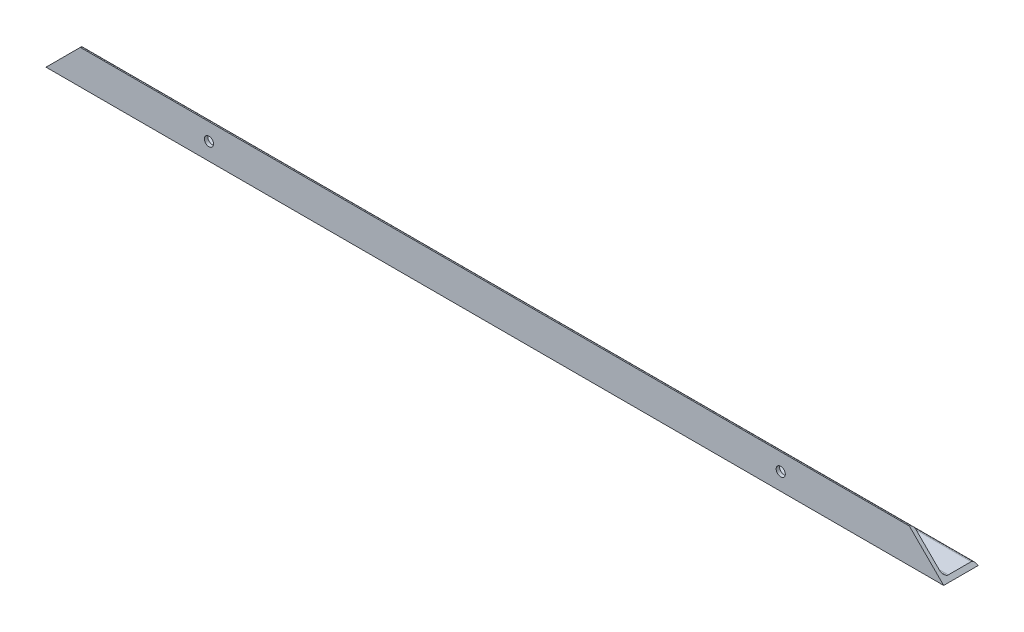
ISO-10303-21;
HEADER;
FILE_DESCRIPTION(('STEP AP214'),'2;1');
FILE_NAME('part.step','',(''),(''),'','','');
FILE_SCHEMA(('AUTOMOTIVE_DESIGN { 1 0 10303 214 1 1 1 1 }'));
ENDSEC;
DATA;
#1=APPLICATION_CONTEXT('core data for automotive mechanical design processes');
#2=APPLICATION_PROTOCOL_DEFINITION('international standard','automotive_design',2000,#1);
#3=PRODUCT_CONTEXT('',#1,'mechanical');
#4=PRODUCT('Part','Part','',(#3));
#5=PRODUCT_RELATED_PRODUCT_CATEGORY('part','',(#4));
#6=PRODUCT_DEFINITION_FORMATION('','',#4);
#7=PRODUCT_DEFINITION_CONTEXT('part definition',#1,'design');
#8=PRODUCT_DEFINITION('design','',#6,#7);
#9=PRODUCT_DEFINITION_SHAPE('','',#8);
#10=(LENGTH_UNIT() NAMED_UNIT(*) SI_UNIT(.MILLI.,.METRE.));
#11=(NAMED_UNIT(*) PLANE_ANGLE_UNIT() SI_UNIT($,.RADIAN.));
#12=(NAMED_UNIT(*) SI_UNIT($,.STERADIAN.) SOLID_ANGLE_UNIT());
#13=UNCERTAINTY_MEASURE_WITH_UNIT(LENGTH_MEASURE(1.E-05),#10,'distance_accuracy_value','');
#14=(GEOMETRIC_REPRESENTATION_CONTEXT(3) GLOBAL_UNCERTAINTY_ASSIGNED_CONTEXT((#13)) GLOBAL_UNIT_ASSIGNED_CONTEXT((#10,
#11,#12)) REPRESENTATION_CONTEXT('',''));
#15=CARTESIAN_POINT('',(0.,0.,0.));
#16=DIRECTION('',(0.,0.,1.));
#17=DIRECTION('',(1.,0.,0.));
#18=AXIS2_PLACEMENT_3D('',#15,#16,#17);
#19=CARTESIAN_POINT('',(1570.,0.,-60.));
#20=DIRECTION('',(0.,1.,0.));
#21=DIRECTION('',(0.,0.,1.));
#22=AXIS2_PLACEMENT_3D('',#19,#20,#21);
#23=PLANE('',#22);
#24=DIRECTION('',(0.,0.,-1.));
#25=VECTOR('',#24,1.);
#26=CARTESIAN_POINT('',(0.,0.,-60.));
#27=LINE('',#26,#25);
#28=CARTESIAN_POINT('',(0.,0.,0.));
#29=VERTEX_POINT('',#28);
#30=CARTESIAN_POINT('',(0.,0.,-60.));
#31=VERTEX_POINT('',#30);
#32=EDGE_CURVE('E113',#29,#31,#27,.T.);
#33=ORIENTED_EDGE('',*,*,#32,.T.);
#34=DIRECTION('',(-1.,0.,0.));
#35=VECTOR('',#34,1.);
#36=CARTESIAN_POINT('',(1570.,0.,-60.));
#37=LINE('',#36,#35);
#38=CARTESIAN_POINT('',(1570.,0.,-60.));
#39=VERTEX_POINT('',#38);
#40=EDGE_CURVE('E13',#39,#31,#37,.T.);
#41=ORIENTED_EDGE('',*,*,#40,.F.);
#42=DIRECTION('',(0.,0.,-1.));
#43=VECTOR('',#42,1.);
#44=CARTESIAN_POINT('',(1570.,0.,-60.));
#45=LINE('',#44,#43);
#46=CARTESIAN_POINT('',(1570.,0.,0.));
#47=VERTEX_POINT('',#46);
#48=EDGE_CURVE('E123',#47,#39,#45,.T.);
#49=ORIENTED_EDGE('',*,*,#48,.F.);
#50=DIRECTION('',(-1.,0.,0.));
#51=VECTOR('',#50,1.);
#52=CARTESIAN_POINT('',(1570.,0.,0.));
#53=LINE('',#52,#51);
#54=EDGE_CURVE('E129',#47,#29,#53,.T.);
#55=ORIENTED_EDGE('',*,*,#54,.T.);
#56=EDGE_LOOP('',(#33,#41,#49,#55));
#57=FACE_BOUND('',#56,.T.);
#58=ADVANCED_FACE('F60',(#57),#23,.F.);
#59=CARTESIAN_POINT('',(1570.,0.,-54.));
#60=DIRECTION('',(-1.,0.,0.));
#61=DIRECTION('',(0.,0.,1.));
#62=AXIS2_PLACEMENT_3D('',#59,#60,#61);
#63=CYLINDRICAL_SURFACE('',#62,6.);
#64=ORIENTED_EDGE('',*,*,#40,.T.);
#65=CARTESIAN_POINT('',(0.,0.,-54.));
#66=DIRECTION('',(0.707106781186547,-0.707106781186547,0.));
#67=DIRECTION('',(-0.707106781186548,-0.707106781186548,0.));
#68=AXIS2_PLACEMENT_3D('',#65,#66,#67);
#69=ELLIPSE('',#68,8.48528137423857,6.);
#70=CARTESIAN_POINT('',(6.00000000000001,6.,-54.));
#71=VERTEX_POINT('',#70);
#72=EDGE_CURVE('E119',#31,#71,#69,.T.);
#73=ORIENTED_EDGE('',*,*,#72,.T.);
#74=DIRECTION('',(-1.,0.,0.));
#75=VECTOR('',#74,1.);
#76=CARTESIAN_POINT('',(1570.,6.,-54.));
#77=LINE('',#76,#75);
#78=CARTESIAN_POINT('',(1564.,6.,-54.));
#79=VERTEX_POINT('',#78);
#80=EDGE_CURVE('E68',#79,#71,#77,.T.);
#81=ORIENTED_EDGE('',*,*,#80,.F.);
#82=CARTESIAN_POINT('',(1570.,0.,-54.));
#83=DIRECTION('',(-0.707106781186547,-0.707106781186548,0.));
#84=DIRECTION('',(-0.707106781186548,0.707106781186547,0.));
#85=AXIS2_PLACEMENT_3D('',#82,#83,#84);
#86=ELLIPSE('',#85,8.48528137423857,6.);
#87=EDGE_CURVE('E159',#79,#39,#86,.T.);
#88=ORIENTED_EDGE('',*,*,#87,.T.);
#89=EDGE_LOOP('',(#64,#73,#81,#88));
#90=FACE_BOUND('',#89,.T.);
#91=ADVANCED_FACE('F158',(#90),#63,.T.);
#92=CARTESIAN_POINT('',(1570.,6.,-14.));
#93=DIRECTION('',(0.,-1.,0.));
#94=DIRECTION('',(0.,0.,-1.));
#95=AXIS2_PLACEMENT_3D('',#92,#93,#94);
#96=PLANE('',#95);
#97=ORIENTED_EDGE('',*,*,#80,.T.);
#98=DIRECTION('',(0.,0.,1.));
#99=VECTOR('',#98,1.);
#100=CARTESIAN_POINT('',(6.00000000000001,6.,-14.));
#101=LINE('',#100,#99);
#102=CARTESIAN_POINT('',(6.00000000000001,6.,-14.));
#103=VERTEX_POINT('',#102);
#104=EDGE_CURVE('E154',#71,#103,#101,.T.);
#105=ORIENTED_EDGE('',*,*,#104,.T.);
#106=DIRECTION('',(-1.,0.,0.));
#107=VECTOR('',#106,1.);
#108=CARTESIAN_POINT('',(1570.,6.,-14.));
#109=LINE('',#108,#107);
#110=CARTESIAN_POINT('',(1564.,6.,-14.));
#111=VERTEX_POINT('',#110);
#112=EDGE_CURVE('E145',#111,#103,#109,.T.);
#113=ORIENTED_EDGE('',*,*,#112,.F.);
#114=DIRECTION('',(0.,0.,-1.));
#115=VECTOR('',#114,1.);
#116=CARTESIAN_POINT('',(1564.,6.,-14.));
#117=LINE('',#116,#115);
#118=EDGE_CURVE('E155',#111,#79,#117,.T.);
#119=ORIENTED_EDGE('',*,*,#118,.T.);
#120=EDGE_LOOP('',(#97,#105,#113,#119));
#121=FACE_BOUND('',#120,.T.);
#122=ADVANCED_FACE('F152',(#121),#96,.F.);
#123=CARTESIAN_POINT('',(1570.,14.,-14.));
#124=DIRECTION('',(-1.,0.,0.));
#125=DIRECTION('',(0.,0.,1.));
#126=AXIS2_PLACEMENT_3D('',#123,#124,#125);
#127=CYLINDRICAL_SURFACE('',#126,8.);
#128=ORIENTED_EDGE('',*,*,#112,.T.);
#129=CARTESIAN_POINT('',(14.,14.,-14.));
#130=DIRECTION('',(0.707106781186547,-0.707106781186547,0.));
#131=DIRECTION('',(-0.707106781186548,-0.707106781186548,0.));
#132=AXIS2_PLACEMENT_3D('',#129,#130,#131);
#133=ELLIPSE('',#132,11.3137084989848,8.);
#134=CARTESIAN_POINT('',(14.0000000000001,14.0000000000001,-6.));
#135=VERTEX_POINT('',#134);
#136=EDGE_CURVE('E165',#103,#135,#133,.F.);
#137=ORIENTED_EDGE('',*,*,#136,.T.);
#138=DIRECTION('',(-1.,0.,0.));
#139=VECTOR('',#138,1.);
#140=CARTESIAN_POINT('',(1570.,14.,-6.));
#141=LINE('',#140,#139);
#142=CARTESIAN_POINT('',(1556.,14.,-6.));
#143=VERTEX_POINT('',#142);
#144=EDGE_CURVE('E142',#143,#135,#141,.T.);
#145=ORIENTED_EDGE('',*,*,#144,.F.);
#146=CARTESIAN_POINT('',(1556.,14.,-14.));
#147=DIRECTION('',(-0.707106781186547,-0.707106781186548,0.));
#148=DIRECTION('',(-0.707106781186548,0.707106781186547,0.));
#149=AXIS2_PLACEMENT_3D('',#146,#147,#148);
#150=ELLIPSE('',#149,11.3137084989848,8.);
#151=EDGE_CURVE('E171',#143,#111,#150,.F.);
#152=ORIENTED_EDGE('',*,*,#151,.T.);
#153=EDGE_LOOP('',(#128,#137,#145,#152));
#154=FACE_BOUND('',#153,.T.);
#155=ADVANCED_FACE('F206',(#154),#127,.F.);
#156=CARTESIAN_POINT('',(1570.,54.,-6.));
#157=DIRECTION('',(0.,0.,1.));
#158=DIRECTION('',(1.,0.,0.));
#159=AXIS2_PLACEMENT_3D('',#156,#157,#158);
#160=PLANE('',#159);
#161=CARTESIAN_POINT('',(1285.,29.9999999999999,-6.));
#162=DIRECTION('',(0.,0.,1.));
#163=DIRECTION('',(1.,0.,0.));
#164=AXIS2_PLACEMENT_3D('',#161,#162,#163);
#165=CIRCLE('',#164,7.99999999999998);
#166=CARTESIAN_POINT('',(1293.,29.9999999999999,-6.));
#167=VERTEX_POINT('',#166);
#168=EDGE_CURVE('E124',#167,#167,#165,.T.);
#169=ORIENTED_EDGE('',*,*,#168,.T.);
#170=EDGE_LOOP('',(#169));
#171=FACE_BOUND('',#170,.T.);
#172=CARTESIAN_POINT('',(285.,29.9999999999999,-6.));
#173=DIRECTION('',(0.,0.,1.));
#174=DIRECTION('',(1.,0.,0.));
#175=AXIS2_PLACEMENT_3D('',#172,#173,#174);
#176=CIRCLE('',#175,7.99999999999998);
#177=CARTESIAN_POINT('',(293.,29.9999999999999,-6.));
#178=VERTEX_POINT('',#177);
#179=EDGE_CURVE('E176',#178,#178,#176,.T.);
#180=ORIENTED_EDGE('',*,*,#179,.T.);
#181=EDGE_LOOP('',(#180));
#182=FACE_BOUND('',#181,.T.);
#183=ORIENTED_EDGE('',*,*,#144,.T.);
#184=DIRECTION('',(0.707106781186548,0.707106781186548,0.));
#185=VECTOR('',#184,1.);
#186=CARTESIAN_POINT('',(812.,812.,-6.));
#187=LINE('',#186,#185);
#188=CARTESIAN_POINT('',(54.,54.,-6.));
#189=VERTEX_POINT('',#188);
#190=EDGE_CURVE('E229',#135,#189,#187,.T.);
#191=ORIENTED_EDGE('',*,*,#190,.T.);
#192=DIRECTION('',(-1.,0.,0.));
#193=VECTOR('',#192,1.);
#194=CARTESIAN_POINT('',(1570.,54.,-6.));
#195=LINE('',#194,#193);
#196=CARTESIAN_POINT('',(1516.,54.,-6.));
#197=VERTEX_POINT('',#196);
#198=EDGE_CURVE('E136',#197,#189,#195,.T.);
#199=ORIENTED_EDGE('',*,*,#198,.F.);
#200=DIRECTION('',(0.707106781186548,-0.707106781186547,0.));
#201=VECTOR('',#200,1.);
#202=CARTESIAN_POINT('',(1543.,27.,-6.));
#203=LINE('',#202,#201);
#204=EDGE_CURVE('E163',#197,#143,#203,.T.);
#205=ORIENTED_EDGE('',*,*,#204,.T.);
#206=EDGE_LOOP('',(#183,#191,#199,#205));
#207=FACE_BOUND('',#206,.T.);
#208=ADVANCED_FACE('F182',(#171,#182,#207),#160,.F.);
#209=CARTESIAN_POINT('',(1570.,54.,0.));
#210=DIRECTION('',(-1.,0.,0.));
#211=DIRECTION('',(0.,0.,1.));
#212=AXIS2_PLACEMENT_3D('',#209,#210,#211);
#213=CYLINDRICAL_SURFACE('',#212,6.);
#214=ORIENTED_EDGE('',*,*,#198,.T.);
#215=CARTESIAN_POINT('',(54.,54.,0.));
#216=DIRECTION('',(0.707106781186547,-0.707106781186547,0.));
#217=DIRECTION('',(-0.707106781186548,-0.707106781186548,0.));
#218=AXIS2_PLACEMENT_3D('',#215,#216,#217);
#219=ELLIPSE('',#218,8.48528137423857,6.);
#220=CARTESIAN_POINT('',(60.,60.,0.));
#221=VERTEX_POINT('',#220);
#222=EDGE_CURVE('E133',#189,#221,#219,.T.);
#223=ORIENTED_EDGE('',*,*,#222,.T.);
#224=DIRECTION('',(-1.,0.,0.));
#225=VECTOR('',#224,1.);
#226=CARTESIAN_POINT('',(1570.,60.,0.));
#227=LINE('',#226,#225);
#228=CARTESIAN_POINT('',(1510.,60.,0.));
#229=VERTEX_POINT('',#228);
#230=EDGE_CURVE('E132',#229,#221,#227,.T.);
#231=ORIENTED_EDGE('',*,*,#230,.F.);
#232=CARTESIAN_POINT('',(1516.,54.,0.));
#233=DIRECTION('',(-0.707106781186547,-0.707106781186548,0.));
#234=DIRECTION('',(-0.707106781186548,0.707106781186547,0.));
#235=AXIS2_PLACEMENT_3D('',#232,#233,#234);
#236=ELLIPSE('',#235,8.48528137423858,6.);
#237=EDGE_CURVE('E160',#229,#197,#236,.T.);
#238=ORIENTED_EDGE('',*,*,#237,.T.);
#239=EDGE_LOOP('',(#214,#223,#231,#238));
#240=FACE_BOUND('',#239,.T.);
#241=ADVANCED_FACE('F214',(#240),#213,.T.);
#242=CARTESIAN_POINT('',(1570.,60.,0.));
#243=DIRECTION('',(0.,0.,-1.));
#244=DIRECTION('',(-1.,0.,0.));
#245=AXIS2_PLACEMENT_3D('',#242,#243,#244);
#246=PLANE('',#245);
#247=CARTESIAN_POINT('',(1285.,29.9999999999999,0.));
#248=DIRECTION('',(0.,0.,1.));
#249=DIRECTION('',(1.,0.,0.));
#250=AXIS2_PLACEMENT_3D('',#247,#248,#249);
#251=CIRCLE('',#250,7.99999999999998);
#252=CARTESIAN_POINT('',(1293.,29.9999999999999,0.));
#253=VERTEX_POINT('',#252);
#254=EDGE_CURVE('E236',#253,#253,#251,.T.);
#255=ORIENTED_EDGE('',*,*,#254,.F.);
#256=EDGE_LOOP('',(#255));
#257=FACE_BOUND('',#256,.T.);
#258=CARTESIAN_POINT('',(285.,29.9999999999999,0.));
#259=DIRECTION('',(0.,0.,1.));
#260=DIRECTION('',(1.,0.,0.));
#261=AXIS2_PLACEMENT_3D('',#258,#259,#260);
#262=CIRCLE('',#261,7.99999999999998);
#263=CARTESIAN_POINT('',(293.,29.9999999999999,0.));
#264=VERTEX_POINT('',#263);
#265=EDGE_CURVE('E233',#264,#264,#262,.T.);
#266=ORIENTED_EDGE('',*,*,#265,.F.);
#267=EDGE_LOOP('',(#266));
#268=FACE_BOUND('',#267,.T.);
#269=ORIENTED_EDGE('',*,*,#230,.T.);
#270=DIRECTION('',(0.707106781186547,0.707106781186547,0.));
#271=VECTOR('',#270,1.);
#272=CARTESIAN_POINT('',(60.,60.,0.));
#273=LINE('',#272,#271);
#274=EDGE_CURVE('E116',#29,#221,#273,.T.);
#275=ORIENTED_EDGE('',*,*,#274,.F.);
#276=ORIENTED_EDGE('',*,*,#54,.F.);
#277=DIRECTION('',(0.707106781186548,-0.707106781186547,0.));
#278=VECTOR('',#277,1.);
#279=CARTESIAN_POINT('',(1510.,60.,0.));
#280=LINE('',#279,#278);
#281=EDGE_CURVE('E74',#229,#47,#280,.T.);
#282=ORIENTED_EDGE('',*,*,#281,.F.);
#283=EDGE_LOOP('',(#269,#275,#276,#282));
#284=FACE_BOUND('',#283,.T.);
#285=ADVANCED_FACE('F128',(#257,#268,#284),#246,.F.);
#286=CARTESIAN_POINT('',(60.,60.,-60.));
#287=DIRECTION('',(0.707106781186547,-0.707106781186547,0.));
#288=DIRECTION('',(0.707106781186548,0.707106781186548,0.));
#289=AXIS2_PLACEMENT_3D('',#286,#287,#288);
#290=PLANE('',#289);
#291=ORIENTED_EDGE('',*,*,#32,.F.);
#292=ORIENTED_EDGE('',*,*,#274,.T.);
#293=ORIENTED_EDGE('',*,*,#222,.F.);
#294=ORIENTED_EDGE('',*,*,#190,.F.);
#295=ORIENTED_EDGE('',*,*,#136,.F.);
#296=ORIENTED_EDGE('',*,*,#104,.F.);
#297=ORIENTED_EDGE('',*,*,#72,.F.);
#298=EDGE_LOOP('',(#291,#292,#293,#294,#295,#296,#297));
#299=FACE_BOUND('',#298,.T.);
#300=ADVANCED_FACE('F115',(#299),#290,.F.);
#301=CARTESIAN_POINT('',(1510.,60.,-60.));
#302=DIRECTION('',(-0.707106781186547,-0.707106781186548,0.));
#303=DIRECTION('',(0.707106781186548,-0.707106781186547,0.));
#304=AXIS2_PLACEMENT_3D('',#301,#302,#303);
#305=PLANE('',#304);
#306=ORIENTED_EDGE('',*,*,#118,.F.);
#307=ORIENTED_EDGE('',*,*,#151,.F.);
#308=ORIENTED_EDGE('',*,*,#204,.F.);
#309=ORIENTED_EDGE('',*,*,#237,.F.);
#310=ORIENTED_EDGE('',*,*,#281,.T.);
#311=ORIENTED_EDGE('',*,*,#48,.T.);
#312=ORIENTED_EDGE('',*,*,#87,.F.);
#313=EDGE_LOOP('',(#306,#307,#308,#309,#310,#311,#312));
#314=FACE_BOUND('',#313,.T.);
#315=ADVANCED_FACE('F193',(#314),#305,.F.);
#316=CARTESIAN_POINT('',(285.,29.9999999999999,-60.));
#317=DIRECTION('',(0.,0.,1.));
#318=DIRECTION('',(1.,0.,0.));
#319=AXIS2_PLACEMENT_3D('',#316,#317,#318);
#320=CYLINDRICAL_SURFACE('',#319,7.99999999999998);
#321=ORIENTED_EDGE('',*,*,#265,.T.);
#322=EDGE_LOOP('',(#321));
#323=FACE_BOUND('',#322,.T.);
#324=ORIENTED_EDGE('',*,*,#179,.F.);
#325=EDGE_LOOP('',(#324));
#326=FACE_BOUND('',#325,.T.);
#327=ADVANCED_FACE('F187',(#323,#326),#320,.F.);
#328=CARTESIAN_POINT('',(1285.,29.9999999999999,-60.));
#329=DIRECTION('',(0.,0.,1.));
#330=DIRECTION('',(1.,0.,0.));
#331=AXIS2_PLACEMENT_3D('',#328,#329,#330);
#332=CYLINDRICAL_SURFACE('',#331,7.99999999999998);
#333=ORIENTED_EDGE('',*,*,#254,.T.);
#334=EDGE_LOOP('',(#333));
#335=FACE_BOUND('',#334,.T.);
#336=ORIENTED_EDGE('',*,*,#168,.F.);
#337=EDGE_LOOP('',(#336));
#338=FACE_BOUND('',#337,.T.);
#339=ADVANCED_FACE('F185',(#335,#338),#332,.F.);
#340=CLOSED_SHELL('',(#58,#91,#122,#155,#208,#241,#285,#300,#315,#327,#339));
#341=MANIFOLD_SOLID_BREP('B2',#340);
#342=ADVANCED_BREP_SHAPE_REPRESENTATION('',(#18,#341),#14);
#343=SHAPE_DEFINITION_REPRESENTATION(#9,#342);
ENDSEC;
END-ISO-10303-21;
